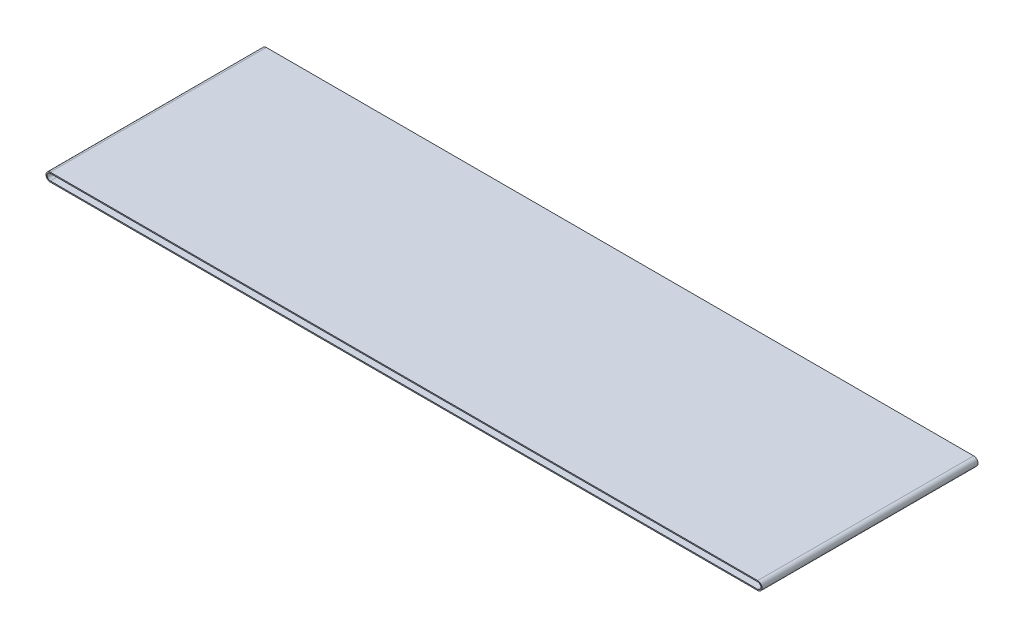
ISO-10303-21;
HEADER;
FILE_DESCRIPTION(('STEP AP214'),'2;1');
FILE_NAME('part.step','',(''),(''),'','','');
FILE_SCHEMA(('AUTOMOTIVE_DESIGN { 1 0 10303 214 1 1 1 1 }'));
ENDSEC;
DATA;
#1=APPLICATION_CONTEXT('core data for automotive mechanical design processes');
#2=APPLICATION_PROTOCOL_DEFINITION('international standard','automotive_design',2000,#1);
#3=PRODUCT_CONTEXT('',#1,'mechanical');
#4=PRODUCT('Part','Part','',(#3));
#5=PRODUCT_RELATED_PRODUCT_CATEGORY('part','',(#4));
#6=PRODUCT_DEFINITION_FORMATION('','',#4);
#7=PRODUCT_DEFINITION_CONTEXT('part definition',#1,'design');
#8=PRODUCT_DEFINITION('design','',#6,#7);
#9=PRODUCT_DEFINITION_SHAPE('','',#8);
#10=(LENGTH_UNIT() NAMED_UNIT(*) SI_UNIT(.MILLI.,.METRE.));
#11=(NAMED_UNIT(*) PLANE_ANGLE_UNIT() SI_UNIT($,.RADIAN.));
#12=(NAMED_UNIT(*) SI_UNIT($,.STERADIAN.) SOLID_ANGLE_UNIT());
#13=UNCERTAINTY_MEASURE_WITH_UNIT(LENGTH_MEASURE(1.E-05),#10,'distance_accuracy_value','');
#14=(GEOMETRIC_REPRESENTATION_CONTEXT(3) GLOBAL_UNCERTAINTY_ASSIGNED_CONTEXT((#13)) GLOBAL_UNIT_ASSIGNED_CONTEXT((#10,
#11,#12)) REPRESENTATION_CONTEXT('',''));
#15=CARTESIAN_POINT('',(0.,0.,0.));
#16=DIRECTION('',(0.,0.,1.));
#17=DIRECTION('',(1.,0.,0.));
#18=AXIS2_PLACEMENT_3D('',#15,#16,#17);
#19=CARTESIAN_POINT('',(-9.99200722162641E-13,-6.70991040507829E-12,100.));
#20=DIRECTION('',(0.,0.,-1.));
#21=DIRECTION('',(-1.,0.,0.));
#22=AXIS2_PLACEMENT_3D('',#19,#20,#21);
#23=PLANE('',#22);
#24=CARTESIAN_POINT('',(-9.99200722162641E-13,-6.70991040507829E-12,100.));
#25=DIRECTION('',(0.,0.,-1.));
#26=DIRECTION('',(-1.,0.,0.));
#27=AXIS2_PLACEMENT_3D('',#24,#25,#26);
#28=CIRCLE('',#27,4.);
#29=CARTESIAN_POINT('',(-9.99243099183166E-13,3.99999999999329,100.));
#30=VERTEX_POINT('',#29);
#31=CARTESIAN_POINT('',(-9.99200722162641E-13,-4.00000000000671,100.));
#32=VERTEX_POINT('',#31);
#33=EDGE_CURVE('E162',#30,#32,#28,.F.);
#34=ORIENTED_EDGE('',*,*,#33,.T.);
#35=DIRECTION('',(1.,0.,0.));
#36=VECTOR('',#35,1.);
#37=CARTESIAN_POINT('',(-9.99158345142115E-13,-4.00000000000671,100.));
#38=LINE('',#37,#36);
#39=CARTESIAN_POINT('',(654.967604407089,-4.0000000000067,100.));
#40=VERTEX_POINT('',#39);
#41=EDGE_CURVE('E165',#32,#40,#38,.T.);
#42=ORIENTED_EDGE('',*,*,#41,.T.);
#43=CARTESIAN_POINT('',(654.967604407089,-6.70297151117438E-12,100.));
#44=DIRECTION('',(0.,0.,-1.));
#45=DIRECTION('',(-1.,0.,0.));
#46=AXIS2_PLACEMENT_3D('',#43,#44,#45);
#47=CIRCLE('',#46,4.);
#48=CARTESIAN_POINT('',(654.967604407089,3.9999999999933,100.));
#49=VERTEX_POINT('',#48);
#50=EDGE_CURVE('E168',#40,#49,#47,.F.);
#51=ORIENTED_EDGE('',*,*,#50,.T.);
#52=DIRECTION('',(-1.,0.,0.));
#53=VECTOR('',#52,1.);
#54=CARTESIAN_POINT('',(-9.99243099183166E-13,3.99999999999329,100.));
#55=LINE('',#54,#53);
#56=EDGE_CURVE('E170',#49,#30,#55,.T.);
#57=ORIENTED_EDGE('',*,*,#56,.T.);
#58=EDGE_LOOP('',(#34,#42,#51,#57));
#59=FACE_BOUND('',#58,.T.);
#60=CARTESIAN_POINT('',(-9.99200722162641E-13,-6.70991040507829E-12,100.));
#61=DIRECTION('',(0.,0.,1.));
#62=DIRECTION('',(-1.,0.,0.));
#63=AXIS2_PLACEMENT_3D('',#60,#61,#62);
#64=CIRCLE('',#63,3.);
#65=CARTESIAN_POINT('',(-9.99232504928035E-13,2.99999999999329,100.));
#66=VERTEX_POINT('',#65);
#67=CARTESIAN_POINT('',(-9.99168939397247E-13,-3.00000000000671,100.));
#68=VERTEX_POINT('',#67);
#69=EDGE_CURVE('E126',#66,#68,#64,.T.);
#70=ORIENTED_EDGE('',*,*,#69,.F.);
#71=DIRECTION('',(-1.,0.,0.));
#72=VECTOR('',#71,1.);
#73=CARTESIAN_POINT('',(-9.99232504928035E-13,2.99999999999329,100.));
#74=LINE('',#73,#72);
#75=CARTESIAN_POINT('',(654.967604407089,2.9999999999933,100.));
#76=VERTEX_POINT('',#75);
#77=EDGE_CURVE('E148',#76,#66,#74,.T.);
#78=ORIENTED_EDGE('',*,*,#77,.F.);
#79=CARTESIAN_POINT('',(654.967604407089,-6.70297151117438E-12,100.));
#80=DIRECTION('',(0.,0.,1.));
#81=DIRECTION('',(-1.,0.,0.));
#82=AXIS2_PLACEMENT_3D('',#79,#80,#81);
#83=CIRCLE('',#82,3.);
#84=CARTESIAN_POINT('',(654.967604407089,-3.0000000000067,100.));
#85=VERTEX_POINT('',#84);
#86=EDGE_CURVE('E146',#85,#76,#83,.T.);
#87=ORIENTED_EDGE('',*,*,#86,.F.);
#88=DIRECTION('',(1.,0.,0.));
#89=VECTOR('',#88,1.);
#90=CARTESIAN_POINT('',(654.967604407089,-3.0000000000067,100.));
#91=LINE('',#90,#89);
#92=EDGE_CURVE('E134',#68,#85,#91,.T.);
#93=ORIENTED_EDGE('',*,*,#92,.F.);
#94=EDGE_LOOP('',(#70,#78,#87,#93));
#95=FACE_BOUND('',#94,.T.);
#96=ADVANCED_FACE('F61',(#59,#95),#23,.F.);
#97=CARTESIAN_POINT('',(-9.99200722162641E-13,-6.70991040507829E-12,-100.));
#98=DIRECTION('',(0.,0.,-1.));
#99=DIRECTION('',(-1.,0.,0.));
#100=AXIS2_PLACEMENT_3D('',#97,#98,#99);
#101=PLANE('',#100);
#102=CARTESIAN_POINT('',(-9.99200722162641E-13,-6.70991040507829E-12,-100.));
#103=DIRECTION('',(0.,0.,-1.));
#104=DIRECTION('',(-1.,0.,0.));
#105=AXIS2_PLACEMENT_3D('',#102,#103,#104);
#106=CIRCLE('',#105,4.);
#107=CARTESIAN_POINT('',(-9.99243099183166E-13,3.99999999999329,-100.));
#108=VERTEX_POINT('',#107);
#109=CARTESIAN_POINT('',(-9.99200722162641E-13,-4.00000000000671,-100.));
#110=VERTEX_POINT('',#109);
#111=EDGE_CURVE('E142',#108,#110,#106,.F.);
#112=ORIENTED_EDGE('',*,*,#111,.F.);
#113=DIRECTION('',(-1.,0.,0.));
#114=VECTOR('',#113,1.);
#115=CARTESIAN_POINT('',(-9.99243099183166E-13,3.99999999999329,-100.));
#116=LINE('',#115,#114);
#117=CARTESIAN_POINT('',(654.967604407089,3.9999999999933,-100.));
#118=VERTEX_POINT('',#117);
#119=EDGE_CURVE('E166',#118,#108,#116,.T.);
#120=ORIENTED_EDGE('',*,*,#119,.F.);
#121=CARTESIAN_POINT('',(654.967604407089,-6.70297151117438E-12,-100.));
#122=DIRECTION('',(0.,0.,-1.));
#123=DIRECTION('',(-1.,0.,0.));
#124=AXIS2_PLACEMENT_3D('',#121,#122,#123);
#125=CIRCLE('',#124,4.);
#126=CARTESIAN_POINT('',(654.967604407089,-4.0000000000067,-100.));
#127=VERTEX_POINT('',#126);
#128=EDGE_CURVE('E177',#127,#118,#125,.F.);
#129=ORIENTED_EDGE('',*,*,#128,.F.);
#130=DIRECTION('',(1.,0.,0.));
#131=VECTOR('',#130,1.);
#132=CARTESIAN_POINT('',(-9.99158345142115E-13,-4.00000000000671,-100.));
#133=LINE('',#132,#131);
#134=EDGE_CURVE('E175',#110,#127,#133,.T.);
#135=ORIENTED_EDGE('',*,*,#134,.F.);
#136=EDGE_LOOP('',(#112,#120,#129,#135));
#137=FACE_BOUND('',#136,.T.);
#138=DIRECTION('',(-1.,0.,0.));
#139=VECTOR('',#138,1.);
#140=CARTESIAN_POINT('',(-9.99232504928035E-13,2.99999999999329,-100.));
#141=LINE('',#140,#139);
#142=CARTESIAN_POINT('',(654.967604407089,2.9999999999933,-100.));
#143=VERTEX_POINT('',#142);
#144=CARTESIAN_POINT('',(-9.99232504928035E-13,2.99999999999329,-100.));
#145=VERTEX_POINT('',#144);
#146=EDGE_CURVE('E135',#143,#145,#141,.T.);
#147=ORIENTED_EDGE('',*,*,#146,.T.);
#148=CARTESIAN_POINT('',(-9.99200722162641E-13,-6.70991040507829E-12,-100.));
#149=DIRECTION('',(0.,0.,1.));
#150=DIRECTION('',(-1.,0.,0.));
#151=AXIS2_PLACEMENT_3D('',#148,#149,#150);
#152=CIRCLE('',#151,3.);
#153=CARTESIAN_POINT('',(-9.99168939397247E-13,-3.00000000000671,-100.));
#154=VERTEX_POINT('',#153);
#155=EDGE_CURVE('E84',#145,#154,#152,.T.);
#156=ORIENTED_EDGE('',*,*,#155,.T.);
#157=DIRECTION('',(1.,0.,0.));
#158=VECTOR('',#157,1.);
#159=CARTESIAN_POINT('',(654.967604407089,-3.0000000000067,-100.));
#160=LINE('',#159,#158);
#161=CARTESIAN_POINT('',(654.967604407089,-3.0000000000067,-100.));
#162=VERTEX_POINT('',#161);
#163=EDGE_CURVE('E141',#154,#162,#160,.T.);
#164=ORIENTED_EDGE('',*,*,#163,.T.);
#165=CARTESIAN_POINT('',(654.967604407089,-6.70297151117438E-12,-100.));
#166=DIRECTION('',(0.,0.,1.));
#167=DIRECTION('',(-1.,0.,0.));
#168=AXIS2_PLACEMENT_3D('',#165,#166,#167);
#169=CIRCLE('',#168,3.);
#170=EDGE_CURVE('E154',#162,#143,#169,.T.);
#171=ORIENTED_EDGE('',*,*,#170,.T.);
#172=EDGE_LOOP('',(#147,#156,#164,#171));
#173=FACE_BOUND('',#172,.T.);
#174=ADVANCED_FACE('F195',(#137,#173),#101,.T.);
#175=CARTESIAN_POINT('',(-9.99200722162641E-13,-6.70991040507829E-12,100.));
#176=DIRECTION('',(0.,0.,-1.));
#177=DIRECTION('',(-1.,0.,0.));
#178=AXIS2_PLACEMENT_3D('',#175,#176,#177);
#179=CYLINDRICAL_SURFACE('',#178,4.);
#180=ORIENTED_EDGE('',*,*,#111,.T.);
#181=DIRECTION('',(0.,0.,-1.));
#182=VECTOR('',#181,1.);
#183=CARTESIAN_POINT('',(-9.99200722162641E-13,-4.00000000000671,100.));
#184=LINE('',#183,#182);
#185=EDGE_CURVE('E12',#32,#110,#184,.T.);
#186=ORIENTED_EDGE('',*,*,#185,.F.);
#187=ORIENTED_EDGE('',*,*,#33,.F.);
#188=DIRECTION('',(0.,0.,-1.));
#189=VECTOR('',#188,1.);
#190=CARTESIAN_POINT('',(-9.99243099183166E-13,3.99999999999329,100.));
#191=LINE('',#190,#189);
#192=EDGE_CURVE('E172',#30,#108,#191,.T.);
#193=ORIENTED_EDGE('',*,*,#192,.T.);
#194=EDGE_LOOP('',(#180,#186,#187,#193));
#195=FACE_BOUND('',#194,.T.);
#196=ADVANCED_FACE('F63',(#195),#179,.T.);
#197=CARTESIAN_POINT('',(-9.99158345142115E-13,-4.00000000000671,100.));
#198=DIRECTION('',(0.,1.,0.));
#199=DIRECTION('',(-1.,0.,0.));
#200=AXIS2_PLACEMENT_3D('',#197,#198,#199);
#201=PLANE('',#200);
#202=ORIENTED_EDGE('',*,*,#134,.T.);
#203=DIRECTION('',(0.,0.,-1.));
#204=VECTOR('',#203,1.);
#205=CARTESIAN_POINT('',(654.967604407089,-4.0000000000067,100.));
#206=LINE('',#205,#204);
#207=EDGE_CURVE('E69',#40,#127,#206,.T.);
#208=ORIENTED_EDGE('',*,*,#207,.F.);
#209=ORIENTED_EDGE('',*,*,#41,.F.);
#210=ORIENTED_EDGE('',*,*,#185,.T.);
#211=EDGE_LOOP('',(#202,#208,#209,#210));
#212=FACE_BOUND('',#211,.T.);
#213=ADVANCED_FACE('F205',(#212),#201,.F.);
#214=CARTESIAN_POINT('',(654.967604407089,-6.70297151117438E-12,100.));
#215=DIRECTION('',(0.,0.,-1.));
#216=DIRECTION('',(-1.,0.,0.));
#217=AXIS2_PLACEMENT_3D('',#214,#215,#216);
#218=CYLINDRICAL_SURFACE('',#217,4.);
#219=ORIENTED_EDGE('',*,*,#128,.T.);
#220=DIRECTION('',(0.,0.,-1.));
#221=VECTOR('',#220,1.);
#222=CARTESIAN_POINT('',(654.967604407089,3.9999999999933,100.));
#223=LINE('',#222,#221);
#224=EDGE_CURVE('E182',#49,#118,#223,.T.);
#225=ORIENTED_EDGE('',*,*,#224,.F.);
#226=ORIENTED_EDGE('',*,*,#50,.F.);
#227=ORIENTED_EDGE('',*,*,#207,.T.);
#228=EDGE_LOOP('',(#219,#225,#226,#227));
#229=FACE_BOUND('',#228,.T.);
#230=ADVANCED_FACE('F189',(#229),#218,.T.);
#231=CARTESIAN_POINT('',(-9.99243099183166E-13,3.99999999999329,100.));
#232=DIRECTION('',(0.,-1.,0.));
#233=DIRECTION('',(1.,0.,0.));
#234=AXIS2_PLACEMENT_3D('',#231,#232,#233);
#235=PLANE('',#234);
#236=ORIENTED_EDGE('',*,*,#119,.T.);
#237=ORIENTED_EDGE('',*,*,#192,.F.);
#238=ORIENTED_EDGE('',*,*,#56,.F.);
#239=ORIENTED_EDGE('',*,*,#224,.T.);
#240=EDGE_LOOP('',(#236,#237,#238,#239));
#241=FACE_BOUND('',#240,.T.);
#242=ADVANCED_FACE('F199',(#241),#235,.F.);
#243=CARTESIAN_POINT('',(-9.99200722162641E-13,-6.70991040507829E-12,100.));
#244=DIRECTION('',(0.,0.,-1.));
#245=DIRECTION('',(-1.,0.,0.));
#246=AXIS2_PLACEMENT_3D('',#243,#244,#245);
#247=CYLINDRICAL_SURFACE('',#246,3.);
#248=ORIENTED_EDGE('',*,*,#155,.F.);
#249=DIRECTION('',(0.,0.,-1.));
#250=VECTOR('',#249,1.);
#251=CARTESIAN_POINT('',(-9.99232504928035E-13,2.99999999999329,100.));
#252=LINE('',#251,#250);
#253=EDGE_CURVE('E130',#66,#145,#252,.T.);
#254=ORIENTED_EDGE('',*,*,#253,.F.);
#255=ORIENTED_EDGE('',*,*,#69,.T.);
#256=DIRECTION('',(0.,0.,-1.));
#257=VECTOR('',#256,1.);
#258=CARTESIAN_POINT('',(-9.99168939397247E-13,-3.00000000000671,100.));
#259=LINE('',#258,#257);
#260=EDGE_CURVE('E129',#68,#154,#259,.T.);
#261=ORIENTED_EDGE('',*,*,#260,.T.);
#262=EDGE_LOOP('',(#248,#254,#255,#261));
#263=FACE_BOUND('',#262,.T.);
#264=ADVANCED_FACE('F128',(#263),#247,.F.);
#265=CARTESIAN_POINT('',(654.967604407089,-3.0000000000067,100.));
#266=DIRECTION('',(0.,1.,0.));
#267=DIRECTION('',(-1.,0.,0.));
#268=AXIS2_PLACEMENT_3D('',#265,#266,#267);
#269=PLANE('',#268);
#270=ORIENTED_EDGE('',*,*,#163,.F.);
#271=ORIENTED_EDGE('',*,*,#260,.F.);
#272=ORIENTED_EDGE('',*,*,#92,.T.);
#273=DIRECTION('',(0.,0.,-1.));
#274=VECTOR('',#273,1.);
#275=CARTESIAN_POINT('',(654.967604407089,-3.0000000000067,100.));
#276=LINE('',#275,#274);
#277=EDGE_CURVE('E143',#85,#162,#276,.T.);
#278=ORIENTED_EDGE('',*,*,#277,.T.);
#279=EDGE_LOOP('',(#270,#271,#272,#278));
#280=FACE_BOUND('',#279,.T.);
#281=ADVANCED_FACE('F138',(#280),#269,.T.);
#282=CARTESIAN_POINT('',(654.967604407089,-6.70297151117438E-12,100.));
#283=DIRECTION('',(0.,0.,-1.));
#284=DIRECTION('',(-1.,0.,0.));
#285=AXIS2_PLACEMENT_3D('',#282,#283,#284);
#286=CYLINDRICAL_SURFACE('',#285,3.);
#287=ORIENTED_EDGE('',*,*,#170,.F.);
#288=ORIENTED_EDGE('',*,*,#277,.F.);
#289=ORIENTED_EDGE('',*,*,#86,.T.);
#290=DIRECTION('',(0.,0.,-1.));
#291=VECTOR('',#290,1.);
#292=CARTESIAN_POINT('',(654.967604407089,2.9999999999933,100.));
#293=LINE('',#292,#291);
#294=EDGE_CURVE('E76',#76,#143,#293,.T.);
#295=ORIENTED_EDGE('',*,*,#294,.T.);
#296=EDGE_LOOP('',(#287,#288,#289,#295));
#297=FACE_BOUND('',#296,.T.);
#298=ADVANCED_FACE('F228',(#297),#286,.F.);
#299=CARTESIAN_POINT('',(-9.99232504928035E-13,2.99999999999329,100.));
#300=DIRECTION('',(0.,-1.,0.));
#301=DIRECTION('',(1.,0.,0.));
#302=AXIS2_PLACEMENT_3D('',#299,#300,#301);
#303=PLANE('',#302);
#304=ORIENTED_EDGE('',*,*,#146,.F.);
#305=ORIENTED_EDGE('',*,*,#294,.F.);
#306=ORIENTED_EDGE('',*,*,#77,.T.);
#307=ORIENTED_EDGE('',*,*,#253,.T.);
#308=EDGE_LOOP('',(#304,#305,#306,#307));
#309=FACE_BOUND('',#308,.T.);
#310=ADVANCED_FACE('F232',(#309),#303,.T.);
#311=CLOSED_SHELL('',(#96,#174,#196,#213,#230,#242,#264,#281,#298,#310));
#312=MANIFOLD_SOLID_BREP('B2',#311);
#313=ADVANCED_BREP_SHAPE_REPRESENTATION('',(#18,#312),#14);
#314=SHAPE_DEFINITION_REPRESENTATION(#9,#313);
ENDSEC;
END-ISO-10303-21;
